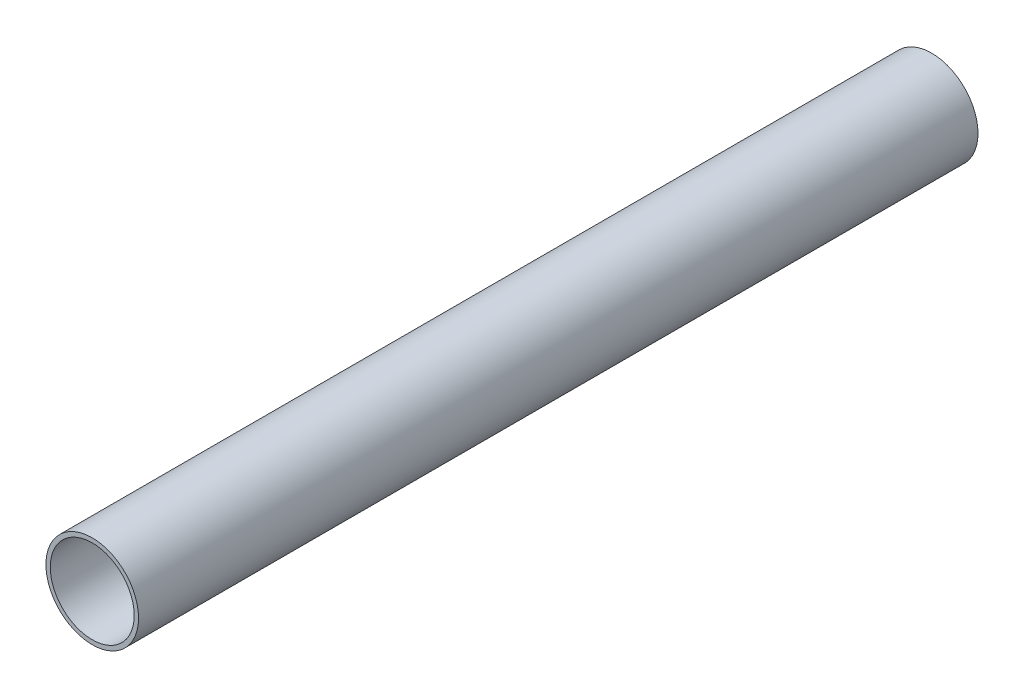
ISO-10303-21;
HEADER;
FILE_DESCRIPTION(('STEP AP214'),'2;1');
FILE_NAME('part.step','',(''),(''),'','','');
FILE_SCHEMA(('AUTOMOTIVE_DESIGN { 1 0 10303 214 1 1 1 1 }'));
ENDSEC;
DATA;
#1=APPLICATION_CONTEXT('core data for automotive mechanical design processes');
#2=APPLICATION_PROTOCOL_DEFINITION('international standard','automotive_design',2000,#1);
#3=PRODUCT_CONTEXT('',#1,'mechanical');
#4=PRODUCT('Part','Part','',(#3));
#5=PRODUCT_RELATED_PRODUCT_CATEGORY('part','',(#4));
#6=PRODUCT_DEFINITION_FORMATION('','',#4);
#7=PRODUCT_DEFINITION_CONTEXT('part definition',#1,'design');
#8=PRODUCT_DEFINITION('design','',#6,#7);
#9=PRODUCT_DEFINITION_SHAPE('','',#8);
#10=(LENGTH_UNIT() NAMED_UNIT(*) SI_UNIT(.MILLI.,.METRE.));
#11=(NAMED_UNIT(*) PLANE_ANGLE_UNIT() SI_UNIT($,.RADIAN.));
#12=(NAMED_UNIT(*) SI_UNIT($,.STERADIAN.) SOLID_ANGLE_UNIT());
#13=UNCERTAINTY_MEASURE_WITH_UNIT(LENGTH_MEASURE(1.E-05),#10,'distance_accuracy_value','');
#14=(GEOMETRIC_REPRESENTATION_CONTEXT(3) GLOBAL_UNCERTAINTY_ASSIGNED_CONTEXT((#13)) GLOBAL_UNIT_ASSIGNED_CONTEXT((#10,
#11,#12)) REPRESENTATION_CONTEXT('',''));
#15=CARTESIAN_POINT('',(0.,0.,0.));
#16=DIRECTION('',(0.,0.,1.));
#17=DIRECTION('',(1.,0.,0.));
#18=AXIS2_PLACEMENT_3D('',#15,#16,#17);
#19=CARTESIAN_POINT('',(0.,7.25,-72.5));
#20=DIRECTION('',(0.,0.,1.));
#21=DIRECTION('',(1.,0.,0.));
#22=AXIS2_PLACEMENT_3D('',#19,#20,#21);
#23=PLANE('',#22);
#24=CARTESIAN_POINT('',(0.,0.,-72.5));
#25=DIRECTION('',(0.,0.,1.));
#26=DIRECTION('',(1.,0.,0.));
#27=AXIS2_PLACEMENT_3D('',#24,#25,#26);
#28=CIRCLE('',#27,7.99999999999999);
#29=CARTESIAN_POINT('',(7.99999999999999,0.,-72.5));
#30=VERTEX_POINT('',#29);
#31=EDGE_CURVE('E10',#30,#30,#28,.T.);
#32=ORIENTED_EDGE('',*,*,#31,.F.);
#33=EDGE_LOOP('',(#32));
#34=FACE_BOUND('',#33,.T.);
#35=CARTESIAN_POINT('',(0.,0.,-72.5));
#36=DIRECTION('',(0.,0.,1.));
#37=DIRECTION('',(1.,0.,0.));
#38=AXIS2_PLACEMENT_3D('',#35,#36,#37);
#39=CIRCLE('',#38,7.25);
#40=CARTESIAN_POINT('',(7.25,0.,-72.5));
#41=VERTEX_POINT('',#40);
#42=EDGE_CURVE('E45',#41,#41,#39,.T.);
#43=ORIENTED_EDGE('',*,*,#42,.T.);
#44=EDGE_LOOP('',(#43));
#45=FACE_BOUND('',#44,.T.);
#46=ADVANCED_FACE('F31',(#34,#45),#23,.F.);
#47=CARTESIAN_POINT('',(0.,0.,72.5));
#48=DIRECTION('',(0.,0.,1.));
#49=DIRECTION('',(1.,0.,0.));
#50=AXIS2_PLACEMENT_3D('',#47,#48,#49);
#51=CYLINDRICAL_SURFACE('',#50,7.99999999999999);
#52=CARTESIAN_POINT('',(0.,0.,72.5));
#53=DIRECTION('',(0.,0.,1.));
#54=DIRECTION('',(1.,0.,0.));
#55=AXIS2_PLACEMENT_3D('',#52,#53,#54);
#56=CIRCLE('',#55,7.99999999999999);
#57=CARTESIAN_POINT('',(7.99999999999999,0.,72.5));
#58=VERTEX_POINT('',#57);
#59=EDGE_CURVE('E37',#58,#58,#56,.T.);
#60=ORIENTED_EDGE('',*,*,#59,.F.);
#61=EDGE_LOOP('',(#60));
#62=FACE_BOUND('',#61,.T.);
#63=ORIENTED_EDGE('',*,*,#31,.T.);
#64=EDGE_LOOP('',(#63));
#65=FACE_BOUND('',#64,.T.);
#66=ADVANCED_FACE('F60',(#62,#65),#51,.T.);
#67=CARTESIAN_POINT('',(0.,7.99999999999999,72.5));
#68=DIRECTION('',(0.,0.,-1.));
#69=DIRECTION('',(-1.,0.,0.));
#70=AXIS2_PLACEMENT_3D('',#67,#68,#69);
#71=PLANE('',#70);
#72=CARTESIAN_POINT('',(0.,0.,72.5));
#73=DIRECTION('',(0.,0.,1.));
#74=DIRECTION('',(1.,0.,0.));
#75=AXIS2_PLACEMENT_3D('',#72,#73,#74);
#76=CIRCLE('',#75,7.25);
#77=CARTESIAN_POINT('',(7.25,0.,72.5));
#78=VERTEX_POINT('',#77);
#79=EDGE_CURVE('E41',#78,#78,#76,.T.);
#80=ORIENTED_EDGE('',*,*,#79,.F.);
#81=EDGE_LOOP('',(#80));
#82=FACE_BOUND('',#81,.T.);
#83=ORIENTED_EDGE('',*,*,#59,.T.);
#84=EDGE_LOOP('',(#83));
#85=FACE_BOUND('',#84,.T.);
#86=ADVANCED_FACE('F55',(#82,#85),#71,.F.);
#87=CARTESIAN_POINT('',(0.,0.,72.5));
#88=DIRECTION('',(0.,0.,1.));
#89=DIRECTION('',(1.,0.,0.));
#90=AXIS2_PLACEMENT_3D('',#87,#88,#89);
#91=CYLINDRICAL_SURFACE('',#90,7.25);
#92=ORIENTED_EDGE('',*,*,#42,.F.);
#93=EDGE_LOOP('',(#92));
#94=FACE_BOUND('',#93,.T.);
#95=ORIENTED_EDGE('',*,*,#79,.T.);
#96=EDGE_LOOP('',(#95));
#97=FACE_BOUND('',#96,.T.);
#98=ADVANCED_FACE('F52',(#94,#97),#91,.F.);
#99=CLOSED_SHELL('',(#46,#66,#86,#98));
#100=MANIFOLD_SOLID_BREP('B2',#99);
#101=ADVANCED_BREP_SHAPE_REPRESENTATION('',(#18,#100),#14);
#102=SHAPE_DEFINITION_REPRESENTATION(#9,#101);
ENDSEC;
END-ISO-10303-21;
